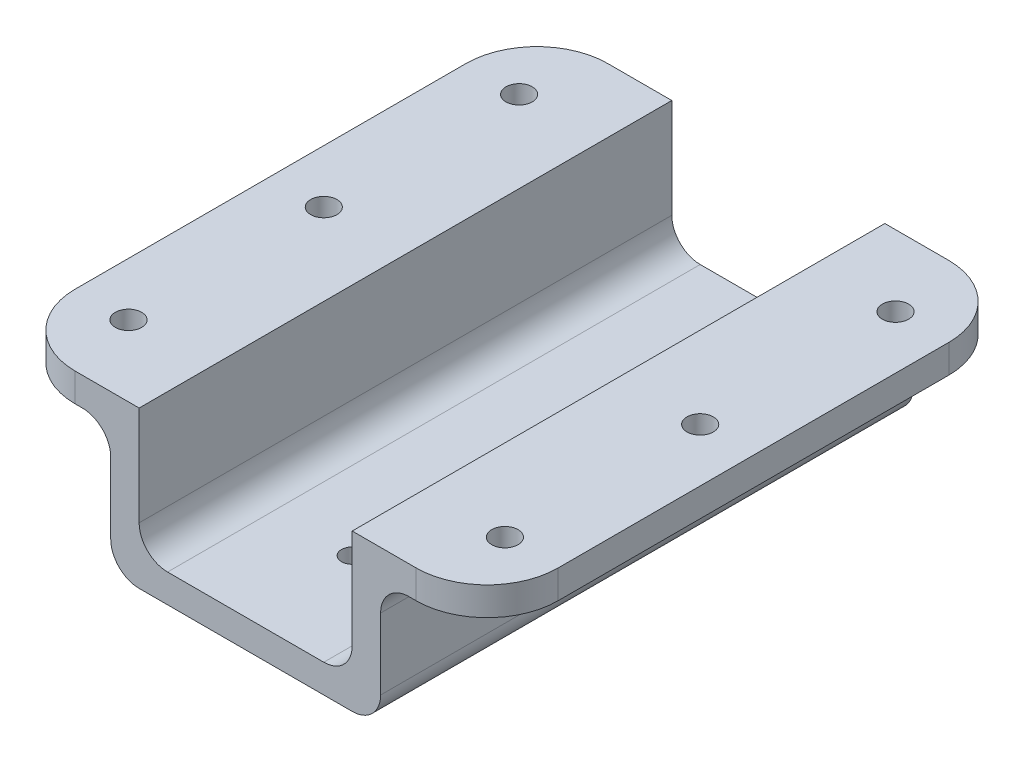
ISO-10303-21;
HEADER;
FILE_DESCRIPTION(('STEP AP214'),'2;1');
FILE_NAME('part.step','',(''),(''),'','','');
FILE_SCHEMA(('AUTOMOTIVE_DESIGN { 1 0 10303 214 1 1 1 1 }'));
ENDSEC;
DATA;
#1=APPLICATION_CONTEXT('core data for automotive mechanical design processes');
#2=APPLICATION_PROTOCOL_DEFINITION('international standard','automotive_design',2000,#1);
#3=PRODUCT_CONTEXT('',#1,'mechanical');
#4=PRODUCT('Part','Part','',(#3));
#5=PRODUCT_RELATED_PRODUCT_CATEGORY('part','',(#4));
#6=PRODUCT_DEFINITION_FORMATION('','',#4);
#7=PRODUCT_DEFINITION_CONTEXT('part definition',#1,'design');
#8=PRODUCT_DEFINITION('design','',#6,#7);
#9=PRODUCT_DEFINITION_SHAPE('','',#8);
#10=(LENGTH_UNIT() NAMED_UNIT(*) SI_UNIT(.MILLI.,.METRE.));
#11=(NAMED_UNIT(*) PLANE_ANGLE_UNIT() SI_UNIT($,.RADIAN.));
#12=(NAMED_UNIT(*) SI_UNIT($,.STERADIAN.) SOLID_ANGLE_UNIT());
#13=UNCERTAINTY_MEASURE_WITH_UNIT(LENGTH_MEASURE(1.E-05),#10,'distance_accuracy_value','');
#14=(GEOMETRIC_REPRESENTATION_CONTEXT(3) GLOBAL_UNCERTAINTY_ASSIGNED_CONTEXT((#13)) GLOBAL_UNIT_ASSIGNED_CONTEXT((#10,
#11,#12)) REPRESENTATION_CONTEXT('',''));
#15=CARTESIAN_POINT('',(0.,0.,0.));
#16=DIRECTION('',(0.,0.,1.));
#17=DIRECTION('',(1.,0.,0.));
#18=AXIS2_PLACEMENT_3D('',#15,#16,#17);
#19=CARTESIAN_POINT('',(-34.,14.,37.5));
#20=DIRECTION('',(1.,0.,0.));
#21=DIRECTION('',(0.,0.,-1.));
#22=AXIS2_PLACEMENT_3D('',#19,#20,#21);
#23=PLANE('',#22);
#24=DIRECTION('',(0.,0.,-1.));
#25=VECTOR('',#24,1.);
#26=CARTESIAN_POINT('',(-34.,18.,37.5));
#27=LINE('',#26,#25);
#28=CARTESIAN_POINT('',(-34.,18.,27.5));
#29=VERTEX_POINT('',#28);
#30=CARTESIAN_POINT('',(-34.,18.,-27.5));
#31=VERTEX_POINT('',#30);
#32=EDGE_CURVE('E223',#29,#31,#27,.T.);
#33=ORIENTED_EDGE('',*,*,#32,.T.);
#34=DIRECTION('',(0.,-1.,0.));
#35=VECTOR('',#34,1.);
#36=CARTESIAN_POINT('',(-34.,14.,-27.5));
#37=LINE('',#36,#35);
#38=CARTESIAN_POINT('',(-34.,14.,-27.5));
#39=VERTEX_POINT('',#38);
#40=EDGE_CURVE('E303',#31,#39,#37,.T.);
#41=ORIENTED_EDGE('',*,*,#40,.T.);
#42=DIRECTION('',(0.,0.,-1.));
#43=VECTOR('',#42,1.);
#44=CARTESIAN_POINT('',(-34.,14.,37.5));
#45=LINE('',#44,#43);
#46=CARTESIAN_POINT('',(-34.,14.,27.5));
#47=VERTEX_POINT('',#46);
#48=EDGE_CURVE('E259',#47,#39,#45,.T.);
#49=ORIENTED_EDGE('',*,*,#48,.F.);
#50=DIRECTION('',(0.,-1.,0.));
#51=VECTOR('',#50,1.);
#52=CARTESIAN_POINT('',(-34.,14.,27.5));
#53=LINE('',#52,#51);
#54=EDGE_CURVE('E57',#47,#29,#53,.F.);
#55=ORIENTED_EDGE('',*,*,#54,.T.);
#56=EDGE_LOOP('',(#33,#41,#49,#55));
#57=FACE_BOUND('',#56,.T.);
#58=ADVANCED_FACE('F35',(#57),#23,.F.);
#59=CARTESIAN_POINT('',(-19.,14.,37.5));
#60=DIRECTION('',(0.,1.,0.));
#61=DIRECTION('',(-1.,0.,0.));
#62=AXIS2_PLACEMENT_3D('',#59,#60,#61);
#63=PLANE('',#62);
#64=CARTESIAN_POINT('',(-26.5,14.,27.5));
#65=DIRECTION('',(0.,1.,0.));
#66=DIRECTION('',(-1.,0.,0.));
#67=AXIS2_PLACEMENT_3D('',#64,#65,#66);
#68=CIRCLE('',#67,1.85);
#69=CARTESIAN_POINT('',(-28.35,14.,27.5));
#70=VERTEX_POINT('',#69);
#71=EDGE_CURVE('E267',#70,#70,#68,.T.);
#72=ORIENTED_EDGE('',*,*,#71,.T.);
#73=EDGE_LOOP('',(#72));
#74=FACE_BOUND('',#73,.T.);
#75=CARTESIAN_POINT('',(-26.5,14.,0.));
#76=DIRECTION('',(0.,1.,0.));
#77=DIRECTION('',(-1.,0.,0.));
#78=AXIS2_PLACEMENT_3D('',#75,#76,#77);
#79=CIRCLE('',#78,1.85);
#80=CARTESIAN_POINT('',(-28.35,14.,0.));
#81=VERTEX_POINT('',#80);
#82=EDGE_CURVE('E546',#81,#81,#79,.T.);
#83=ORIENTED_EDGE('',*,*,#82,.T.);
#84=EDGE_LOOP('',(#83));
#85=FACE_BOUND('',#84,.T.);
#86=CARTESIAN_POINT('',(-26.5,14.,-27.5));
#87=DIRECTION('',(0.,1.,0.));
#88=DIRECTION('',(-1.,0.,0.));
#89=AXIS2_PLACEMENT_3D('',#86,#87,#88);
#90=CIRCLE('',#89,1.85);
#91=CARTESIAN_POINT('',(-28.35,14.,-27.5));
#92=VERTEX_POINT('',#91);
#93=EDGE_CURVE('E548',#92,#92,#90,.T.);
#94=ORIENTED_EDGE('',*,*,#93,.T.);
#95=EDGE_LOOP('',(#94));
#96=FACE_BOUND('',#95,.T.);
#97=ORIENTED_EDGE('',*,*,#48,.T.);
#98=CARTESIAN_POINT('',(-24.,14.,-27.5));
#99=DIRECTION('',(0.,1.,0.));
#100=DIRECTION('',(-1.,0.,0.));
#101=AXIS2_PLACEMENT_3D('',#98,#99,#100);
#102=CIRCLE('',#101,10.);
#103=CARTESIAN_POINT('',(-24.,14.,-37.5));
#104=VERTEX_POINT('',#103);
#105=EDGE_CURVE('E310',#39,#104,#102,.F.);
#106=ORIENTED_EDGE('',*,*,#105,.T.);
#107=DIRECTION('',(1.,0.,0.));
#108=VECTOR('',#107,1.);
#109=CARTESIAN_POINT('',(-19.,14.,-37.5));
#110=LINE('',#109,#108);
#111=CARTESIAN_POINT('',(-23.,14.,-37.5));
#112=VERTEX_POINT('',#111);
#113=EDGE_CURVE('E224',#104,#112,#110,.T.);
#114=ORIENTED_EDGE('',*,*,#113,.T.);
#115=DIRECTION('',(0.,0.,-1.));
#116=VECTOR('',#115,1.);
#117=CARTESIAN_POINT('',(-23.,14.,37.5));
#118=LINE('',#117,#116);
#119=CARTESIAN_POINT('',(-23.,14.,37.5));
#120=VERTEX_POINT('',#119);
#121=EDGE_CURVE('E306',#112,#120,#118,.F.);
#122=ORIENTED_EDGE('',*,*,#121,.T.);
#123=DIRECTION('',(1.,0.,0.));
#124=VECTOR('',#123,1.);
#125=CARTESIAN_POINT('',(-19.,14.,37.5));
#126=LINE('',#125,#124);
#127=CARTESIAN_POINT('',(-24.,14.,37.5));
#128=VERTEX_POINT('',#127);
#129=EDGE_CURVE('E250',#128,#120,#126,.T.);
#130=ORIENTED_EDGE('',*,*,#129,.F.);
#131=CARTESIAN_POINT('',(-24.,14.,27.5));
#132=DIRECTION('',(0.,1.,0.));
#133=DIRECTION('',(-1.,0.,0.));
#134=AXIS2_PLACEMENT_3D('',#131,#132,#133);
#135=CIRCLE('',#134,10.);
#136=EDGE_CURVE('E308',#128,#47,#135,.F.);
#137=ORIENTED_EDGE('',*,*,#136,.T.);
#138=EDGE_LOOP('',(#97,#106,#114,#122,#130,#137));
#139=FACE_BOUND('',#138,.T.);
#140=ADVANCED_FACE('F376',(#74,#85,#96,#139),#63,.F.);
#141=CARTESIAN_POINT('',(-19.,-4.00000000000001,37.5));
#142=DIRECTION('',(1.,0.,0.));
#143=DIRECTION('',(0.,1.,0.));
#144=AXIS2_PLACEMENT_3D('',#141,#142,#143);
#145=PLANE('',#144);
#146=DIRECTION('',(0.,-1.,0.));
#147=VECTOR('',#146,1.);
#148=CARTESIAN_POINT('',(-19.,-4.00000000000001,37.5));
#149=LINE('',#148,#147);
#150=CARTESIAN_POINT('',(-19.,10.,37.5));
#151=VERTEX_POINT('',#150);
#152=CARTESIAN_POINT('',(-19.,0.,37.5));
#153=VERTEX_POINT('',#152);
#154=EDGE_CURVE('E393',#151,#153,#149,.T.);
#155=ORIENTED_EDGE('',*,*,#154,.F.);
#156=DIRECTION('',(0.,0.,-1.));
#157=VECTOR('',#156,1.);
#158=CARTESIAN_POINT('',(-19.,10.,-37.5));
#159=LINE('',#158,#157);
#160=CARTESIAN_POINT('',(-19.,10.,-37.5));
#161=VERTEX_POINT('',#160);
#162=EDGE_CURVE('E317',#151,#161,#159,.T.);
#163=ORIENTED_EDGE('',*,*,#162,.T.);
#164=DIRECTION('',(0.,-1.,0.));
#165=VECTOR('',#164,1.);
#166=CARTESIAN_POINT('',(-19.,-4.00000000000001,-37.5));
#167=LINE('',#166,#165);
#168=CARTESIAN_POINT('',(-19.,0.,-37.5));
#169=VERTEX_POINT('',#168);
#170=EDGE_CURVE('E227',#161,#169,#167,.T.);
#171=ORIENTED_EDGE('',*,*,#170,.T.);
#172=DIRECTION('',(0.,0.,-1.));
#173=VECTOR('',#172,1.);
#174=CARTESIAN_POINT('',(-19.,0.,37.5));
#175=LINE('',#174,#173);
#176=EDGE_CURVE('E315',#169,#153,#175,.F.);
#177=ORIENTED_EDGE('',*,*,#176,.T.);
#178=EDGE_LOOP('',(#155,#163,#171,#177));
#179=FACE_BOUND('',#178,.T.);
#180=ADVANCED_FACE('F390',(#179),#145,.F.);
#181=CARTESIAN_POINT('',(19.,-4.,37.5));
#182=DIRECTION('',(0.,1.,0.));
#183=DIRECTION('',(-1.,0.,0.));
#184=AXIS2_PLACEMENT_3D('',#181,#182,#183);
#185=PLANE('',#184);
#186=CARTESIAN_POINT('',(0.,-4.,-22.5));
#187=DIRECTION('',(0.,-1.,0.));
#188=DIRECTION('',(1.,0.,0.));
#189=AXIS2_PLACEMENT_3D('',#186,#187,#188);
#190=CIRCLE('',#189,1.5);
#191=CARTESIAN_POINT('',(1.50000000000001,-4.,-22.5));
#192=VERTEX_POINT('',#191);
#193=EDGE_CURVE('E572',#192,#192,#190,.T.);
#194=ORIENTED_EDGE('',*,*,#193,.F.);
#195=EDGE_LOOP('',(#194));
#196=FACE_BOUND('',#195,.T.);
#197=CARTESIAN_POINT('',(0.,-4.,22.5));
#198=DIRECTION('',(0.,-1.,0.));
#199=DIRECTION('',(1.,0.,0.));
#200=AXIS2_PLACEMENT_3D('',#197,#198,#199);
#201=CIRCLE('',#200,1.5);
#202=CARTESIAN_POINT('',(1.5,-4.,22.5));
#203=VERTEX_POINT('',#202);
#204=EDGE_CURVE('E553',#203,#203,#201,.T.);
#205=ORIENTED_EDGE('',*,*,#204,.F.);
#206=EDGE_LOOP('',(#205));
#207=FACE_BOUND('',#206,.T.);
#208=DIRECTION('',(1.,0.,0.));
#209=VECTOR('',#208,1.);
#210=CARTESIAN_POINT('',(19.,-4.,-37.5));
#211=LINE('',#210,#209);
#212=CARTESIAN_POINT('',(-15.,-4.,-37.5));
#213=VERTEX_POINT('',#212);
#214=CARTESIAN_POINT('',(15.,-4.,-37.5));
#215=VERTEX_POINT('',#214);
#216=EDGE_CURVE('E231',#213,#215,#211,.T.);
#217=ORIENTED_EDGE('',*,*,#216,.T.);
#218=DIRECTION('',(0.,0.,-1.));
#219=VECTOR('',#218,1.);
#220=CARTESIAN_POINT('',(15.,-4.,37.5));
#221=LINE('',#220,#219);
#222=CARTESIAN_POINT('',(15.,-4.,37.5));
#223=VERTEX_POINT('',#222);
#224=EDGE_CURVE('E328',#215,#223,#221,.F.);
#225=ORIENTED_EDGE('',*,*,#224,.T.);
#226=DIRECTION('',(1.,0.,0.));
#227=VECTOR('',#226,1.);
#228=CARTESIAN_POINT('',(19.,-4.,37.5));
#229=LINE('',#228,#227);
#230=CARTESIAN_POINT('',(-15.,-4.,37.5));
#231=VERTEX_POINT('',#230);
#232=EDGE_CURVE('E395',#231,#223,#229,.T.);
#233=ORIENTED_EDGE('',*,*,#232,.F.);
#234=DIRECTION('',(0.,0.,-1.));
#235=VECTOR('',#234,1.);
#236=CARTESIAN_POINT('',(-15.,-4.,37.5));
#237=LINE('',#236,#235);
#238=EDGE_CURVE('E325',#231,#213,#237,.T.);
#239=ORIENTED_EDGE('',*,*,#238,.T.);
#240=EDGE_LOOP('',(#217,#225,#233,#239));
#241=FACE_BOUND('',#240,.T.);
#242=ADVANCED_FACE('F473',(#196,#207,#241),#185,.F.);
#243=CARTESIAN_POINT('',(19.,14.,37.5));
#244=DIRECTION('',(-1.,0.,0.));
#245=DIRECTION('',(0.,-1.,0.));
#246=AXIS2_PLACEMENT_3D('',#243,#244,#245);
#247=PLANE('',#246);
#248=DIRECTION('',(0.,1.,0.));
#249=VECTOR('',#248,1.);
#250=CARTESIAN_POINT('',(19.,14.,-37.5));
#251=LINE('',#250,#249);
#252=CARTESIAN_POINT('',(19.,0.,-37.5));
#253=VERTEX_POINT('',#252);
#254=CARTESIAN_POINT('',(19.,10.,-37.5));
#255=VERTEX_POINT('',#254);
#256=EDGE_CURVE('E234',#253,#255,#251,.T.);
#257=ORIENTED_EDGE('',*,*,#256,.T.);
#258=DIRECTION('',(0.,0.,-1.));
#259=VECTOR('',#258,1.);
#260=CARTESIAN_POINT('',(19.,10.,37.5));
#261=LINE('',#260,#259);
#262=CARTESIAN_POINT('',(19.,10.,37.5));
#263=VERTEX_POINT('',#262);
#264=EDGE_CURVE('E323',#255,#263,#261,.F.);
#265=ORIENTED_EDGE('',*,*,#264,.T.);
#266=DIRECTION('',(0.,1.,0.));
#267=VECTOR('',#266,1.);
#268=CARTESIAN_POINT('',(19.,14.,37.5));
#269=LINE('',#268,#267);
#270=CARTESIAN_POINT('',(19.,0.,37.5));
#271=VERTEX_POINT('',#270);
#272=EDGE_CURVE('E398',#271,#263,#269,.T.);
#273=ORIENTED_EDGE('',*,*,#272,.F.);
#274=DIRECTION('',(0.,0.,-1.));
#275=VECTOR('',#274,1.);
#276=CARTESIAN_POINT('',(19.,0.,37.5));
#277=LINE('',#276,#275);
#278=EDGE_CURVE('E320',#271,#253,#277,.T.);
#279=ORIENTED_EDGE('',*,*,#278,.T.);
#280=EDGE_LOOP('',(#257,#265,#273,#279));
#281=FACE_BOUND('',#280,.T.);
#282=ADVANCED_FACE('F467',(#281),#247,.F.);
#283=CARTESIAN_POINT('',(34.,14.,37.5));
#284=DIRECTION('',(0.,1.,0.));
#285=DIRECTION('',(-1.,0.,0.));
#286=AXIS2_PLACEMENT_3D('',#283,#284,#285);
#287=PLANE('',#286);
#288=CARTESIAN_POINT('',(26.5,14.,27.5));
#289=DIRECTION('',(0.,1.,0.));
#290=DIRECTION('',(-1.,0.,0.));
#291=AXIS2_PLACEMENT_3D('',#288,#289,#290);
#292=CIRCLE('',#291,1.85);
#293=CARTESIAN_POINT('',(24.65,14.,27.5));
#294=VERTEX_POINT('',#293);
#295=EDGE_CURVE('E228',#294,#294,#292,.T.);
#296=ORIENTED_EDGE('',*,*,#295,.T.);
#297=EDGE_LOOP('',(#296));
#298=FACE_BOUND('',#297,.T.);
#299=CARTESIAN_POINT('',(26.5,14.,-27.5));
#300=DIRECTION('',(0.,1.,0.));
#301=DIRECTION('',(-1.,0.,0.));
#302=AXIS2_PLACEMENT_3D('',#299,#300,#301);
#303=CIRCLE('',#302,1.85);
#304=CARTESIAN_POINT('',(24.65,14.,-27.5));
#305=VERTEX_POINT('',#304);
#306=EDGE_CURVE('E559',#305,#305,#303,.T.);
#307=ORIENTED_EDGE('',*,*,#306,.T.);
#308=EDGE_LOOP('',(#307));
#309=FACE_BOUND('',#308,.T.);
#310=CARTESIAN_POINT('',(26.5,14.,0.));
#311=DIRECTION('',(0.,1.,0.));
#312=DIRECTION('',(-1.,0.,0.));
#313=AXIS2_PLACEMENT_3D('',#310,#311,#312);
#314=CIRCLE('',#313,1.85);
#315=CARTESIAN_POINT('',(24.65,14.,0.));
#316=VERTEX_POINT('',#315);
#317=EDGE_CURVE('E270',#316,#316,#314,.T.);
#318=ORIENTED_EDGE('',*,*,#317,.T.);
#319=EDGE_LOOP('',(#318));
#320=FACE_BOUND('',#319,.T.);
#321=DIRECTION('',(0.,0.,-1.));
#322=VECTOR('',#321,1.);
#323=CARTESIAN_POINT('',(34.,14.,37.5));
#324=LINE('',#323,#322);
#325=CARTESIAN_POINT('',(34.,14.,27.5));
#326=VERTEX_POINT('',#325);
#327=CARTESIAN_POINT('',(34.,14.,-27.5));
#328=VERTEX_POINT('',#327);
#329=EDGE_CURVE('E256',#326,#328,#324,.T.);
#330=ORIENTED_EDGE('',*,*,#329,.F.);
#331=CARTESIAN_POINT('',(24.,14.,27.5));
#332=DIRECTION('',(0.,1.,0.));
#333=DIRECTION('',(-1.,0.,0.));
#334=AXIS2_PLACEMENT_3D('',#331,#332,#333);
#335=CIRCLE('',#334,10.);
#336=CARTESIAN_POINT('',(24.,14.,37.5));
#337=VERTEX_POINT('',#336);
#338=EDGE_CURVE('E292',#326,#337,#335,.F.);
#339=ORIENTED_EDGE('',*,*,#338,.T.);
#340=DIRECTION('',(1.,0.,0.));
#341=VECTOR('',#340,1.);
#342=CARTESIAN_POINT('',(34.,14.,37.5));
#343=LINE('',#342,#341);
#344=CARTESIAN_POINT('',(23.,14.,37.5));
#345=VERTEX_POINT('',#344);
#346=EDGE_CURVE('E196',#345,#337,#343,.T.);
#347=ORIENTED_EDGE('',*,*,#346,.F.);
#348=DIRECTION('',(0.,0.,-1.));
#349=VECTOR('',#348,1.);
#350=CARTESIAN_POINT('',(23.,14.,-37.5));
#351=LINE('',#350,#349);
#352=CARTESIAN_POINT('',(23.,14.,-37.5));
#353=VERTEX_POINT('',#352);
#354=EDGE_CURVE('E287',#345,#353,#351,.T.);
#355=ORIENTED_EDGE('',*,*,#354,.T.);
#356=DIRECTION('',(1.,0.,0.));
#357=VECTOR('',#356,1.);
#358=CARTESIAN_POINT('',(34.,14.,-37.5));
#359=LINE('',#358,#357);
#360=CARTESIAN_POINT('',(24.,14.,-37.5));
#361=VERTEX_POINT('',#360);
#362=EDGE_CURVE('E237',#353,#361,#359,.T.);
#363=ORIENTED_EDGE('',*,*,#362,.T.);
#364=CARTESIAN_POINT('',(24.,14.,-27.5));
#365=DIRECTION('',(0.,1.,0.));
#366=DIRECTION('',(-1.,0.,0.));
#367=AXIS2_PLACEMENT_3D('',#364,#365,#366);
#368=CIRCLE('',#367,10.);
#369=EDGE_CURVE('E290',#361,#328,#368,.F.);
#370=ORIENTED_EDGE('',*,*,#369,.T.);
#371=EDGE_LOOP('',(#330,#339,#347,#355,#363,#370));
#372=FACE_BOUND('',#371,.T.);
#373=ADVANCED_FACE('F470',(#298,#309,#320,#372),#287,.F.);
#374=CARTESIAN_POINT('',(34.,18.,37.5));
#375=DIRECTION('',(-1.,0.,0.));
#376=DIRECTION('',(0.,0.,1.));
#377=AXIS2_PLACEMENT_3D('',#374,#375,#376);
#378=PLANE('',#377);
#379=DIRECTION('',(0.,0.,-1.));
#380=VECTOR('',#379,1.);
#381=CARTESIAN_POINT('',(34.,18.,37.5));
#382=LINE('',#381,#380);
#383=CARTESIAN_POINT('',(34.,18.,27.5));
#384=VERTEX_POINT('',#383);
#385=CARTESIAN_POINT('',(34.,18.,-27.5));
#386=VERTEX_POINT('',#385);
#387=EDGE_CURVE('E206',#384,#386,#382,.T.);
#388=ORIENTED_EDGE('',*,*,#387,.F.);
#389=DIRECTION('',(0.,1.,0.));
#390=VECTOR('',#389,1.);
#391=CARTESIAN_POINT('',(34.,18.,27.5));
#392=LINE('',#391,#390);
#393=EDGE_CURVE('E285',#384,#326,#392,.F.);
#394=ORIENTED_EDGE('',*,*,#393,.T.);
#395=ORIENTED_EDGE('',*,*,#329,.T.);
#396=DIRECTION('',(0.,1.,0.));
#397=VECTOR('',#396,1.);
#398=CARTESIAN_POINT('',(34.,18.,-27.5));
#399=LINE('',#398,#397);
#400=EDGE_CURVE('E282',#328,#386,#399,.T.);
#401=ORIENTED_EDGE('',*,*,#400,.T.);
#402=EDGE_LOOP('',(#388,#394,#395,#401));
#403=FACE_BOUND('',#402,.T.);
#404=ADVANCED_FACE('F414',(#403),#378,.F.);
#405=CARTESIAN_POINT('',(15.,18.,37.5));
#406=DIRECTION('',(0.,-1.,0.));
#407=DIRECTION('',(1.,0.,0.));
#408=AXIS2_PLACEMENT_3D('',#405,#406,#407);
#409=PLANE('',#408);
#410=CARTESIAN_POINT('',(26.5,18.,27.5));
#411=DIRECTION('',(0.,-1.,0.));
#412=DIRECTION('',(1.,0.,0.));
#413=AXIS2_PLACEMENT_3D('',#410,#411,#412);
#414=CIRCLE('',#413,1.85);
#415=CARTESIAN_POINT('',(28.35,18.,27.5));
#416=VERTEX_POINT('',#415);
#417=EDGE_CURVE('E576',#416,#416,#414,.T.);
#418=ORIENTED_EDGE('',*,*,#417,.T.);
#419=EDGE_LOOP('',(#418));
#420=FACE_BOUND('',#419,.T.);
#421=CARTESIAN_POINT('',(26.5,18.,-27.5));
#422=DIRECTION('',(0.,-1.,0.));
#423=DIRECTION('',(1.,0.,0.));
#424=AXIS2_PLACEMENT_3D('',#421,#422,#423);
#425=CIRCLE('',#424,1.85);
#426=CARTESIAN_POINT('',(28.35,18.,-27.5));
#427=VERTEX_POINT('',#426);
#428=EDGE_CURVE('E573',#427,#427,#425,.T.);
#429=ORIENTED_EDGE('',*,*,#428,.T.);
#430=EDGE_LOOP('',(#429));
#431=FACE_BOUND('',#430,.T.);
#432=CARTESIAN_POINT('',(26.5,18.,0.));
#433=DIRECTION('',(0.,-1.,0.));
#434=DIRECTION('',(1.,0.,0.));
#435=AXIS2_PLACEMENT_3D('',#432,#433,#434);
#436=CIRCLE('',#435,1.85);
#437=CARTESIAN_POINT('',(28.35,18.,0.));
#438=VERTEX_POINT('',#437);
#439=EDGE_CURVE('E577',#438,#438,#436,.T.);
#440=ORIENTED_EDGE('',*,*,#439,.T.);
#441=EDGE_LOOP('',(#440));
#442=FACE_BOUND('',#441,.T.);
#443=DIRECTION('',(-1.,0.,0.));
#444=VECTOR('',#443,1.);
#445=CARTESIAN_POINT('',(15.,18.,37.5));
#446=LINE('',#445,#444);
#447=CARTESIAN_POINT('',(24.,18.,37.5));
#448=VERTEX_POINT('',#447);
#449=CARTESIAN_POINT('',(15.,18.,37.5));
#450=VERTEX_POINT('',#449);
#451=EDGE_CURVE('E186',#448,#450,#446,.T.);
#452=ORIENTED_EDGE('',*,*,#451,.F.);
#453=CARTESIAN_POINT('',(24.,18.,27.5));
#454=DIRECTION('',(0.,-1.,0.));
#455=DIRECTION('',(1.,0.,0.));
#456=AXIS2_PLACEMENT_3D('',#453,#454,#455);
#457=CIRCLE('',#456,10.);
#458=EDGE_CURVE('E280',#448,#384,#457,.F.);
#459=ORIENTED_EDGE('',*,*,#458,.T.);
#460=ORIENTED_EDGE('',*,*,#387,.T.);
#461=CARTESIAN_POINT('',(24.,18.,-27.5));
#462=DIRECTION('',(0.,-1.,0.));
#463=DIRECTION('',(1.,0.,0.));
#464=AXIS2_PLACEMENT_3D('',#461,#462,#463);
#465=CIRCLE('',#464,10.);
#466=CARTESIAN_POINT('',(24.,18.,-37.5));
#467=VERTEX_POINT('',#466);
#468=EDGE_CURVE('E278',#386,#467,#465,.F.);
#469=ORIENTED_EDGE('',*,*,#468,.T.);
#470=DIRECTION('',(-1.,0.,0.));
#471=VECTOR('',#470,1.);
#472=CARTESIAN_POINT('',(15.,18.,-37.5));
#473=LINE('',#472,#471);
#474=CARTESIAN_POINT('',(15.,18.,-37.5));
#475=VERTEX_POINT('',#474);
#476=EDGE_CURVE('E202',#467,#475,#473,.T.);
#477=ORIENTED_EDGE('',*,*,#476,.T.);
#478=DIRECTION('',(0.,0.,-1.));
#479=VECTOR('',#478,1.);
#480=CARTESIAN_POINT('',(15.,18.,37.5));
#481=LINE('',#480,#479);
#482=EDGE_CURVE('E199',#450,#475,#481,.T.);
#483=ORIENTED_EDGE('',*,*,#482,.F.);
#484=EDGE_LOOP('',(#452,#459,#460,#469,#477,#483));
#485=FACE_BOUND('',#484,.T.);
#486=ADVANCED_FACE('F200',(#420,#431,#442,#485),#409,.F.);
#487=CARTESIAN_POINT('',(15.,0.,37.5));
#488=DIRECTION('',(1.,0.,0.));
#489=DIRECTION('',(0.,1.,0.));
#490=AXIS2_PLACEMENT_3D('',#487,#488,#489);
#491=PLANE('',#490);
#492=DIRECTION('',(0.,-1.,0.));
#493=VECTOR('',#492,1.);
#494=CARTESIAN_POINT('',(15.,0.,-37.5));
#495=LINE('',#494,#493);
#496=CARTESIAN_POINT('',(15.,4.00000000000001,-37.5));
#497=VERTEX_POINT('',#496);
#498=EDGE_CURVE('E241',#475,#497,#495,.T.);
#499=ORIENTED_EDGE('',*,*,#498,.T.);
#500=DIRECTION('',(0.,0.,-1.));
#501=VECTOR('',#500,1.);
#502=CARTESIAN_POINT('',(15.,4.00000000000001,37.5));
#503=LINE('',#502,#501);
#504=CARTESIAN_POINT('',(15.,4.00000000000001,37.5));
#505=VERTEX_POINT('',#504);
#506=EDGE_CURVE('E211',#497,#505,#503,.F.);
#507=ORIENTED_EDGE('',*,*,#506,.T.);
#508=DIRECTION('',(0.,-1.,0.));
#509=VECTOR('',#508,1.);
#510=CARTESIAN_POINT('',(15.,0.,37.5));
#511=LINE('',#510,#509);
#512=EDGE_CURVE('E191',#450,#505,#511,.T.);
#513=ORIENTED_EDGE('',*,*,#512,.F.);
#514=ORIENTED_EDGE('',*,*,#482,.T.);
#515=EDGE_LOOP('',(#499,#507,#513,#514));
#516=FACE_BOUND('',#515,.T.);
#517=ADVANCED_FACE('F209',(#516),#491,.F.);
#518=CARTESIAN_POINT('',(-15.,0.,37.5));
#519=DIRECTION('',(0.,-1.,0.));
#520=DIRECTION('',(1.,0.,0.));
#521=AXIS2_PLACEMENT_3D('',#518,#519,#520);
#522=PLANE('',#521);
#523=CARTESIAN_POINT('',(0.,0.,-22.5));
#524=DIRECTION('',(0.,-1.,0.));
#525=DIRECTION('',(1.,0.,0.));
#526=AXIS2_PLACEMENT_3D('',#523,#524,#525);
#527=CIRCLE('',#526,1.5);
#528=CARTESIAN_POINT('',(1.50000000000001,0.,-22.5));
#529=VERTEX_POINT('',#528);
#530=EDGE_CURVE('E266',#529,#529,#527,.T.);
#531=ORIENTED_EDGE('',*,*,#530,.T.);
#532=EDGE_LOOP('',(#531));
#533=FACE_BOUND('',#532,.T.);
#534=CARTESIAN_POINT('',(0.,0.,22.5));
#535=DIRECTION('',(0.,-1.,0.));
#536=DIRECTION('',(1.,0.,0.));
#537=AXIS2_PLACEMENT_3D('',#534,#535,#536);
#538=CIRCLE('',#537,1.5);
#539=CARTESIAN_POINT('',(1.5,0.,22.5));
#540=VERTEX_POINT('',#539);
#541=EDGE_CURVE('E263',#540,#540,#538,.T.);
#542=ORIENTED_EDGE('',*,*,#541,.T.);
#543=EDGE_LOOP('',(#542));
#544=FACE_BOUND('',#543,.T.);
#545=DIRECTION('',(-1.,0.,0.));
#546=VECTOR('',#545,1.);
#547=CARTESIAN_POINT('',(-15.,0.,37.5));
#548=LINE('',#547,#546);
#549=CARTESIAN_POINT('',(11.,0.,37.5));
#550=VERTEX_POINT('',#549);
#551=CARTESIAN_POINT('',(-11.,0.,37.5));
#552=VERTEX_POINT('',#551);
#553=EDGE_CURVE('E212',#550,#552,#548,.T.);
#554=ORIENTED_EDGE('',*,*,#553,.F.);
#555=DIRECTION('',(0.,0.,-1.));
#556=VECTOR('',#555,1.);
#557=CARTESIAN_POINT('',(11.,0.,-37.5));
#558=LINE('',#557,#556);
#559=CARTESIAN_POINT('',(11.,0.,-37.5));
#560=VERTEX_POINT('',#559);
#561=EDGE_CURVE('E332',#550,#560,#558,.T.);
#562=ORIENTED_EDGE('',*,*,#561,.T.);
#563=DIRECTION('',(-1.,0.,0.));
#564=VECTOR('',#563,1.);
#565=CARTESIAN_POINT('',(-15.,0.,-37.5));
#566=LINE('',#565,#564);
#567=CARTESIAN_POINT('',(-11.,0.,-37.5));
#568=VERTEX_POINT('',#567);
#569=EDGE_CURVE('E243',#560,#568,#566,.T.);
#570=ORIENTED_EDGE('',*,*,#569,.T.);
#571=DIRECTION('',(0.,0.,-1.));
#572=VECTOR('',#571,1.);
#573=CARTESIAN_POINT('',(-11.,0.,37.5));
#574=LINE('',#573,#572);
#575=EDGE_CURVE('E330',#568,#552,#574,.F.);
#576=ORIENTED_EDGE('',*,*,#575,.T.);
#577=EDGE_LOOP('',(#554,#562,#570,#576));
#578=FACE_BOUND('',#577,.T.);
#579=ADVANCED_FACE('F360',(#533,#544,#578),#522,.F.);
#580=CARTESIAN_POINT('',(-15.,18.,37.5));
#581=DIRECTION('',(-1.,0.,0.));
#582=DIRECTION('',(0.,-1.,0.));
#583=AXIS2_PLACEMENT_3D('',#580,#581,#582);
#584=PLANE('',#583);
#585=DIRECTION('',(0.,1.,0.));
#586=VECTOR('',#585,1.);
#587=CARTESIAN_POINT('',(-15.,18.,37.5));
#588=LINE('',#587,#586);
#589=CARTESIAN_POINT('',(-15.,4.,37.5));
#590=VERTEX_POINT('',#589);
#591=CARTESIAN_POINT('',(-15.,18.,37.5));
#592=VERTEX_POINT('',#591);
#593=EDGE_CURVE('E215',#590,#592,#588,.T.);
#594=ORIENTED_EDGE('',*,*,#593,.F.);
#595=DIRECTION('',(0.,0.,-1.));
#596=VECTOR('',#595,1.);
#597=CARTESIAN_POINT('',(-15.,4.,-37.5));
#598=LINE('',#597,#596);
#599=CARTESIAN_POINT('',(-15.,4.,-37.5));
#600=VERTEX_POINT('',#599);
#601=EDGE_CURVE('E336',#590,#600,#598,.T.);
#602=ORIENTED_EDGE('',*,*,#601,.T.);
#603=DIRECTION('',(0.,1.,0.));
#604=VECTOR('',#603,1.);
#605=CARTESIAN_POINT('',(-15.,18.,-37.5));
#606=LINE('',#605,#604);
#607=CARTESIAN_POINT('',(-15.,18.,-37.5));
#608=VERTEX_POINT('',#607);
#609=EDGE_CURVE('E246',#600,#608,#606,.T.);
#610=ORIENTED_EDGE('',*,*,#609,.T.);
#611=DIRECTION('',(0.,0.,-1.));
#612=VECTOR('',#611,1.);
#613=CARTESIAN_POINT('',(-15.,18.,37.5));
#614=LINE('',#613,#612);
#615=EDGE_CURVE('E207',#592,#608,#614,.T.);
#616=ORIENTED_EDGE('',*,*,#615,.F.);
#617=EDGE_LOOP('',(#594,#602,#610,#616));
#618=FACE_BOUND('',#617,.T.);
#619=ADVANCED_FACE('F366',(#618),#584,.F.);
#620=CARTESIAN_POINT('',(-34.,18.,37.5));
#621=DIRECTION('',(0.,-1.,0.));
#622=DIRECTION('',(0.,0.,-1.));
#623=AXIS2_PLACEMENT_3D('',#620,#621,#622);
#624=PLANE('',#623);
#625=CARTESIAN_POINT('',(-26.5,18.,27.5));
#626=DIRECTION('',(0.,-1.,0.));
#627=DIRECTION('',(1.,0.,0.));
#628=AXIS2_PLACEMENT_3D('',#625,#626,#627);
#629=CIRCLE('',#628,1.85);
#630=CARTESIAN_POINT('',(-24.65,18.,27.5));
#631=VERTEX_POINT('',#630);
#632=EDGE_CURVE('E583',#631,#631,#629,.T.);
#633=ORIENTED_EDGE('',*,*,#632,.T.);
#634=EDGE_LOOP('',(#633));
#635=FACE_BOUND('',#634,.T.);
#636=CARTESIAN_POINT('',(-26.5,18.,0.));
#637=DIRECTION('',(0.,-1.,0.));
#638=DIRECTION('',(1.,0.,0.));
#639=AXIS2_PLACEMENT_3D('',#636,#637,#638);
#640=CIRCLE('',#639,1.85);
#641=CARTESIAN_POINT('',(-24.65,18.,0.));
#642=VERTEX_POINT('',#641);
#643=EDGE_CURVE('E543',#642,#642,#640,.T.);
#644=ORIENTED_EDGE('',*,*,#643,.T.);
#645=EDGE_LOOP('',(#644));
#646=FACE_BOUND('',#645,.T.);
#647=CARTESIAN_POINT('',(-26.5,18.,-27.5));
#648=DIRECTION('',(0.,-1.,0.));
#649=DIRECTION('',(1.,0.,0.));
#650=AXIS2_PLACEMENT_3D('',#647,#648,#649);
#651=CIRCLE('',#650,1.85);
#652=CARTESIAN_POINT('',(-24.65,18.,-27.5));
#653=VERTEX_POINT('',#652);
#654=EDGE_CURVE('E580',#653,#653,#651,.T.);
#655=ORIENTED_EDGE('',*,*,#654,.T.);
#656=EDGE_LOOP('',(#655));
#657=FACE_BOUND('',#656,.T.);
#658=DIRECTION('',(-1.,0.,0.));
#659=VECTOR('',#658,1.);
#660=CARTESIAN_POINT('',(-34.,18.,-37.5));
#661=LINE('',#660,#659);
#662=CARTESIAN_POINT('',(-24.,18.,-37.5));
#663=VERTEX_POINT('',#662);
#664=EDGE_CURVE('E248',#608,#663,#661,.T.);
#665=ORIENTED_EDGE('',*,*,#664,.T.);
#666=CARTESIAN_POINT('',(-24.,18.,-27.5));
#667=DIRECTION('',(0.,-1.,0.));
#668=DIRECTION('',(0.,0.,-1.));
#669=AXIS2_PLACEMENT_3D('',#666,#667,#668);
#670=CIRCLE('',#669,10.);
#671=EDGE_CURVE('E50',#663,#31,#670,.F.);
#672=ORIENTED_EDGE('',*,*,#671,.T.);
#673=ORIENTED_EDGE('',*,*,#32,.F.);
#674=CARTESIAN_POINT('',(-24.,18.,27.5));
#675=DIRECTION('',(0.,-1.,0.));
#676=DIRECTION('',(0.,0.,-1.));
#677=AXIS2_PLACEMENT_3D('',#674,#675,#676);
#678=CIRCLE('',#677,10.);
#679=CARTESIAN_POINT('',(-24.,18.,37.5));
#680=VERTEX_POINT('',#679);
#681=EDGE_CURVE('E312',#29,#680,#678,.F.);
#682=ORIENTED_EDGE('',*,*,#681,.T.);
#683=DIRECTION('',(-1.,0.,0.));
#684=VECTOR('',#683,1.);
#685=CARTESIAN_POINT('',(-34.,18.,37.5));
#686=LINE('',#685,#684);
#687=EDGE_CURVE('E220',#592,#680,#686,.T.);
#688=ORIENTED_EDGE('',*,*,#687,.F.);
#689=ORIENTED_EDGE('',*,*,#615,.T.);
#690=EDGE_LOOP('',(#665,#672,#673,#682,#688,#689));
#691=FACE_BOUND('',#690,.T.);
#692=ADVANCED_FACE('F368',(#635,#646,#657,#691),#624,.F.);
#693=CARTESIAN_POINT('',(0.,0.,37.5));
#694=DIRECTION('',(0.,0.,-1.));
#695=DIRECTION('',(-1.,0.,0.));
#696=AXIS2_PLACEMENT_3D('',#693,#694,#695);
#697=PLANE('',#696);
#698=ORIENTED_EDGE('',*,*,#346,.T.);
#699=DIRECTION('',(0.,1.,0.));
#700=VECTOR('',#699,1.);
#701=CARTESIAN_POINT('',(24.,0.,37.5));
#702=LINE('',#701,#700);
#703=EDGE_CURVE('E194',#337,#448,#702,.T.);
#704=ORIENTED_EDGE('',*,*,#703,.T.);
#705=ORIENTED_EDGE('',*,*,#451,.T.);
#706=ORIENTED_EDGE('',*,*,#512,.T.);
#707=CARTESIAN_POINT('',(11.,4.00000000000001,37.5));
#708=DIRECTION('',(0.,0.,-1.));
#709=DIRECTION('',(-1.,0.,0.));
#710=AXIS2_PLACEMENT_3D('',#707,#708,#709);
#711=CIRCLE('',#710,4.);
#712=EDGE_CURVE('E349',#505,#550,#711,.T.);
#713=ORIENTED_EDGE('',*,*,#712,.T.);
#714=ORIENTED_EDGE('',*,*,#553,.T.);
#715=CARTESIAN_POINT('',(-11.,4.,37.5));
#716=DIRECTION('',(0.,0.,-1.));
#717=DIRECTION('',(-1.,0.,0.));
#718=AXIS2_PLACEMENT_3D('',#715,#716,#717);
#719=CIRCLE('',#718,4.);
#720=EDGE_CURVE('E12',#552,#590,#719,.T.);
#721=ORIENTED_EDGE('',*,*,#720,.T.);
#722=ORIENTED_EDGE('',*,*,#593,.T.);
#723=ORIENTED_EDGE('',*,*,#687,.T.);
#724=DIRECTION('',(0.,-1.,0.));
#725=VECTOR('',#724,1.);
#726=CARTESIAN_POINT('',(-24.,0.,37.5));
#727=LINE('',#726,#725);
#728=EDGE_CURVE('E274',#680,#128,#727,.T.);
#729=ORIENTED_EDGE('',*,*,#728,.T.);
#730=ORIENTED_EDGE('',*,*,#129,.T.);
#731=CARTESIAN_POINT('',(-23.,10.,37.5));
#732=DIRECTION('',(0.,0.,-1.));
#733=DIRECTION('',(-1.,0.,0.));
#734=AXIS2_PLACEMENT_3D('',#731,#732,#733);
#735=CIRCLE('',#734,4.);
#736=EDGE_CURVE('E341',#120,#151,#735,.T.);
#737=ORIENTED_EDGE('',*,*,#736,.T.);
#738=ORIENTED_EDGE('',*,*,#154,.T.);
#739=CARTESIAN_POINT('',(-15.,0.,37.5));
#740=DIRECTION('',(0.,0.,-1.));
#741=DIRECTION('',(-1.,0.,0.));
#742=AXIS2_PLACEMENT_3D('',#739,#740,#741);
#743=CIRCLE('',#742,4.);
#744=EDGE_CURVE('E262',#153,#231,#743,.F.);
#745=ORIENTED_EDGE('',*,*,#744,.T.);
#746=ORIENTED_EDGE('',*,*,#232,.T.);
#747=CARTESIAN_POINT('',(15.,0.,37.5));
#748=DIRECTION('',(0.,0.,-1.));
#749=DIRECTION('',(-1.,0.,0.));
#750=AXIS2_PLACEMENT_3D('',#747,#748,#749);
#751=CIRCLE('',#750,4.);
#752=EDGE_CURVE('E272',#223,#271,#751,.F.);
#753=ORIENTED_EDGE('',*,*,#752,.T.);
#754=ORIENTED_EDGE('',*,*,#272,.T.);
#755=CARTESIAN_POINT('',(23.,10.,37.5));
#756=DIRECTION('',(0.,0.,-1.));
#757=DIRECTION('',(-1.,0.,0.));
#758=AXIS2_PLACEMENT_3D('',#755,#756,#757);
#759=CIRCLE('',#758,4.);
#760=EDGE_CURVE('E345',#263,#345,#759,.T.);
#761=ORIENTED_EDGE('',*,*,#760,.T.);
#762=EDGE_LOOP('',(#698,#704,#705,#706,#713,#714,#721,#722,#723,#729,#730,#737,#738,#745,#746,
#753,#754,#761));
#763=FACE_BOUND('',#762,.T.);
#764=ADVANCED_FACE('F189',(#763),#697,.F.);
#765=CARTESIAN_POINT('',(0.,0.,-37.5));
#766=DIRECTION('',(0.,0.,-1.));
#767=DIRECTION('',(-1.,0.,0.));
#768=AXIS2_PLACEMENT_3D('',#765,#766,#767);
#769=PLANE('',#768);
#770=ORIENTED_EDGE('',*,*,#476,.F.);
#771=DIRECTION('',(0.,1.,0.));
#772=VECTOR('',#771,1.);
#773=CARTESIAN_POINT('',(24.,14.,-37.5));
#774=LINE('',#773,#772);
#775=EDGE_CURVE('E300',#467,#361,#774,.F.);
#776=ORIENTED_EDGE('',*,*,#775,.T.);
#777=ORIENTED_EDGE('',*,*,#362,.F.);
#778=CARTESIAN_POINT('',(23.,10.,-37.5));
#779=DIRECTION('',(0.,0.,-1.));
#780=DIRECTION('',(-1.,0.,0.));
#781=AXIS2_PLACEMENT_3D('',#778,#779,#780);
#782=CIRCLE('',#781,4.);
#783=EDGE_CURVE('E343',#353,#255,#782,.F.);
#784=ORIENTED_EDGE('',*,*,#783,.T.);
#785=ORIENTED_EDGE('',*,*,#256,.F.);
#786=CARTESIAN_POINT('',(15.,0.,-37.5));
#787=DIRECTION('',(0.,0.,-1.));
#788=DIRECTION('',(-1.,0.,0.));
#789=AXIS2_PLACEMENT_3D('',#786,#787,#788);
#790=CIRCLE('',#789,4.);
#791=EDGE_CURVE('E296',#253,#215,#790,.T.);
#792=ORIENTED_EDGE('',*,*,#791,.T.);
#793=ORIENTED_EDGE('',*,*,#216,.F.);
#794=CARTESIAN_POINT('',(-15.,0.,-37.5));
#795=DIRECTION('',(0.,0.,-1.));
#796=DIRECTION('',(-1.,0.,0.));
#797=AXIS2_PLACEMENT_3D('',#794,#795,#796);
#798=CIRCLE('',#797,4.);
#799=EDGE_CURVE('E294',#213,#169,#798,.T.);
#800=ORIENTED_EDGE('',*,*,#799,.T.);
#801=ORIENTED_EDGE('',*,*,#170,.F.);
#802=CARTESIAN_POINT('',(-23.,10.,-37.5));
#803=DIRECTION('',(0.,0.,-1.));
#804=DIRECTION('',(-1.,0.,0.));
#805=AXIS2_PLACEMENT_3D('',#802,#803,#804);
#806=CIRCLE('',#805,4.);
#807=EDGE_CURVE('E339',#161,#112,#806,.F.);
#808=ORIENTED_EDGE('',*,*,#807,.T.);
#809=ORIENTED_EDGE('',*,*,#113,.F.);
#810=DIRECTION('',(0.,-1.,0.));
#811=VECTOR('',#810,1.);
#812=CARTESIAN_POINT('',(-24.,18.,-37.5));
#813=LINE('',#812,#811);
#814=EDGE_CURVE('E298',#104,#663,#813,.F.);
#815=ORIENTED_EDGE('',*,*,#814,.T.);
#816=ORIENTED_EDGE('',*,*,#664,.F.);
#817=ORIENTED_EDGE('',*,*,#609,.F.);
#818=CARTESIAN_POINT('',(-11.,4.,-37.5));
#819=DIRECTION('',(0.,0.,-1.));
#820=DIRECTION('',(-1.,0.,0.));
#821=AXIS2_PLACEMENT_3D('',#818,#819,#820);
#822=CIRCLE('',#821,4.);
#823=EDGE_CURVE('E43',#600,#568,#822,.F.);
#824=ORIENTED_EDGE('',*,*,#823,.T.);
#825=ORIENTED_EDGE('',*,*,#569,.F.);
#826=CARTESIAN_POINT('',(11.,4.00000000000001,-37.5));
#827=DIRECTION('',(0.,0.,-1.));
#828=DIRECTION('',(-1.,0.,0.));
#829=AXIS2_PLACEMENT_3D('',#826,#827,#828);
#830=CIRCLE('',#829,4.);
#831=EDGE_CURVE('E347',#560,#497,#830,.F.);
#832=ORIENTED_EDGE('',*,*,#831,.T.);
#833=ORIENTED_EDGE('',*,*,#498,.F.);
#834=EDGE_LOOP('',(#770,#776,#777,#784,#785,#792,#793,#800,#801,#808,#809,#815,#816,#817,#824,
#825,#832,#833));
#835=FACE_BOUND('',#834,.T.);
#836=ADVANCED_FACE('F353',(#835),#769,.T.);
#837=CARTESIAN_POINT('',(-26.5,18.,-27.5));
#838=DIRECTION('',(0.,-1.,0.));
#839=DIRECTION('',(1.,0.,0.));
#840=AXIS2_PLACEMENT_3D('',#837,#838,#839);
#841=CYLINDRICAL_SURFACE('',#840,1.85);
#842=ORIENTED_EDGE('',*,*,#654,.F.);
#843=EDGE_LOOP('',(#842));
#844=FACE_BOUND('',#843,.T.);
#845=ORIENTED_EDGE('',*,*,#93,.F.);
#846=EDGE_LOOP('',(#845));
#847=FACE_BOUND('',#846,.T.);
#848=ADVANCED_FACE('F506',(#844,#847),#841,.F.);
#849=CARTESIAN_POINT('',(-26.5,18.,0.));
#850=DIRECTION('',(0.,-1.,0.));
#851=DIRECTION('',(1.,0.,0.));
#852=AXIS2_PLACEMENT_3D('',#849,#850,#851);
#853=CYLINDRICAL_SURFACE('',#852,1.85);
#854=ORIENTED_EDGE('',*,*,#643,.F.);
#855=EDGE_LOOP('',(#854));
#856=FACE_BOUND('',#855,.T.);
#857=ORIENTED_EDGE('',*,*,#82,.F.);
#858=EDGE_LOOP('',(#857));
#859=FACE_BOUND('',#858,.T.);
#860=ADVANCED_FACE('F528',(#856,#859),#853,.F.);
#861=CARTESIAN_POINT('',(-26.5,18.,27.5));
#862=DIRECTION('',(0.,-1.,0.));
#863=DIRECTION('',(1.,0.,0.));
#864=AXIS2_PLACEMENT_3D('',#861,#862,#863);
#865=CYLINDRICAL_SURFACE('',#864,1.85);
#866=ORIENTED_EDGE('',*,*,#632,.F.);
#867=EDGE_LOOP('',(#866));
#868=FACE_BOUND('',#867,.T.);
#869=ORIENTED_EDGE('',*,*,#71,.F.);
#870=EDGE_LOOP('',(#869));
#871=FACE_BOUND('',#870,.T.);
#872=ADVANCED_FACE('F513',(#868,#871),#865,.F.);
#873=CARTESIAN_POINT('',(0.,18.,22.5));
#874=DIRECTION('',(0.,-1.,0.));
#875=DIRECTION('',(1.,0.,0.));
#876=AXIS2_PLACEMENT_3D('',#873,#874,#875);
#877=CYLINDRICAL_SURFACE('',#876,1.5);
#878=ORIENTED_EDGE('',*,*,#204,.T.);
#879=EDGE_LOOP('',(#878));
#880=FACE_BOUND('',#879,.T.);
#881=ORIENTED_EDGE('',*,*,#541,.F.);
#882=EDGE_LOOP('',(#881));
#883=FACE_BOUND('',#882,.T.);
#884=ADVANCED_FACE('F509',(#880,#883),#877,.F.);
#885=CARTESIAN_POINT('',(0.,18.,-22.5));
#886=DIRECTION('',(0.,-1.,0.));
#887=DIRECTION('',(1.,0.,0.));
#888=AXIS2_PLACEMENT_3D('',#885,#886,#887);
#889=CYLINDRICAL_SURFACE('',#888,1.5);
#890=ORIENTED_EDGE('',*,*,#193,.T.);
#891=EDGE_LOOP('',(#890));
#892=FACE_BOUND('',#891,.T.);
#893=ORIENTED_EDGE('',*,*,#530,.F.);
#894=EDGE_LOOP('',(#893));
#895=FACE_BOUND('',#894,.T.);
#896=ADVANCED_FACE('F512',(#892,#895),#889,.F.);
#897=CARTESIAN_POINT('',(26.5,18.,0.));
#898=DIRECTION('',(0.,-1.,0.));
#899=DIRECTION('',(1.,0.,0.));
#900=AXIS2_PLACEMENT_3D('',#897,#898,#899);
#901=CYLINDRICAL_SURFACE('',#900,1.85);
#902=ORIENTED_EDGE('',*,*,#439,.F.);
#903=EDGE_LOOP('',(#902));
#904=FACE_BOUND('',#903,.T.);
#905=ORIENTED_EDGE('',*,*,#317,.F.);
#906=EDGE_LOOP('',(#905));
#907=FACE_BOUND('',#906,.T.);
#908=ADVANCED_FACE('F518',(#904,#907),#901,.F.);
#909=CARTESIAN_POINT('',(26.5,18.,-27.5));
#910=DIRECTION('',(0.,-1.,0.));
#911=DIRECTION('',(1.,0.,0.));
#912=AXIS2_PLACEMENT_3D('',#909,#910,#911);
#913=CYLINDRICAL_SURFACE('',#912,1.85);
#914=ORIENTED_EDGE('',*,*,#428,.F.);
#915=EDGE_LOOP('',(#914));
#916=FACE_BOUND('',#915,.T.);
#917=ORIENTED_EDGE('',*,*,#306,.F.);
#918=EDGE_LOOP('',(#917));
#919=FACE_BOUND('',#918,.T.);
#920=ADVANCED_FACE('F515',(#916,#919),#913,.F.);
#921=CARTESIAN_POINT('',(26.5,18.,27.5));
#922=DIRECTION('',(0.,-1.,0.));
#923=DIRECTION('',(1.,0.,0.));
#924=AXIS2_PLACEMENT_3D('',#921,#922,#923);
#925=CYLINDRICAL_SURFACE('',#924,1.85);
#926=ORIENTED_EDGE('',*,*,#417,.F.);
#927=EDGE_LOOP('',(#926));
#928=FACE_BOUND('',#927,.T.);
#929=ORIENTED_EDGE('',*,*,#295,.F.);
#930=EDGE_LOOP('',(#929));
#931=FACE_BOUND('',#930,.T.);
#932=ADVANCED_FACE('F444',(#928,#931),#925,.F.);
#933=CARTESIAN_POINT('',(24.,0.,27.5));
#934=DIRECTION('',(0.,1.,0.));
#935=DIRECTION('',(0.,0.,1.));
#936=AXIS2_PLACEMENT_3D('',#933,#934,#935);
#937=CYLINDRICAL_SURFACE('',#936,10.);
#938=ORIENTED_EDGE('',*,*,#338,.F.);
#939=ORIENTED_EDGE('',*,*,#393,.F.);
#940=ORIENTED_EDGE('',*,*,#458,.F.);
#941=ORIENTED_EDGE('',*,*,#703,.F.);
#942=EDGE_LOOP('',(#938,#939,#940,#941));
#943=FACE_BOUND('',#942,.T.);
#944=ADVANCED_FACE('F410',(#943),#937,.T.);
#945=CARTESIAN_POINT('',(24.,18.,-27.5));
#946=DIRECTION('',(0.,-1.,0.));
#947=DIRECTION('',(0.,0.,-1.));
#948=AXIS2_PLACEMENT_3D('',#945,#946,#947);
#949=CYLINDRICAL_SURFACE('',#948,10.);
#950=ORIENTED_EDGE('',*,*,#369,.F.);
#951=ORIENTED_EDGE('',*,*,#775,.F.);
#952=ORIENTED_EDGE('',*,*,#468,.F.);
#953=ORIENTED_EDGE('',*,*,#400,.F.);
#954=EDGE_LOOP('',(#950,#951,#952,#953));
#955=FACE_BOUND('',#954,.T.);
#956=ADVANCED_FACE('F419',(#955),#949,.T.);
#957=CARTESIAN_POINT('',(-24.,14.,-27.5));
#958=DIRECTION('',(0.,1.,0.));
#959=DIRECTION('',(0.,0.,1.));
#960=AXIS2_PLACEMENT_3D('',#957,#958,#959);
#961=CYLINDRICAL_SURFACE('',#960,10.);
#962=ORIENTED_EDGE('',*,*,#671,.F.);
#963=ORIENTED_EDGE('',*,*,#814,.F.);
#964=ORIENTED_EDGE('',*,*,#105,.F.);
#965=ORIENTED_EDGE('',*,*,#40,.F.);
#966=EDGE_LOOP('',(#962,#963,#964,#965));
#967=FACE_BOUND('',#966,.T.);
#968=ADVANCED_FACE('F379',(#967),#961,.T.);
#969=CARTESIAN_POINT('',(-24.,0.,27.5));
#970=DIRECTION('',(0.,-1.,0.));
#971=DIRECTION('',(0.,0.,-1.));
#972=AXIS2_PLACEMENT_3D('',#969,#970,#971);
#973=CYLINDRICAL_SURFACE('',#972,10.);
#974=ORIENTED_EDGE('',*,*,#681,.F.);
#975=ORIENTED_EDGE('',*,*,#54,.F.);
#976=ORIENTED_EDGE('',*,*,#136,.F.);
#977=ORIENTED_EDGE('',*,*,#728,.F.);
#978=EDGE_LOOP('',(#974,#975,#976,#977));
#979=FACE_BOUND('',#978,.T.);
#980=ADVANCED_FACE('F374',(#979),#973,.T.);
#981=CARTESIAN_POINT('',(-23.,10.,37.5));
#982=DIRECTION('',(0.,0.,1.));
#983=DIRECTION('',(1.,0.,0.));
#984=AXIS2_PLACEMENT_3D('',#981,#982,#983);
#985=CYLINDRICAL_SURFACE('',#984,4.);
#986=ORIENTED_EDGE('',*,*,#736,.F.);
#987=ORIENTED_EDGE('',*,*,#121,.F.);
#988=ORIENTED_EDGE('',*,*,#807,.F.);
#989=ORIENTED_EDGE('',*,*,#162,.F.);
#990=EDGE_LOOP('',(#986,#987,#988,#989));
#991=FACE_BOUND('',#990,.T.);
#992=ADVANCED_FACE('F387',(#991),#985,.F.);
#993=CARTESIAN_POINT('',(23.,10.,37.5));
#994=DIRECTION('',(0.,0.,1.));
#995=DIRECTION('',(1.,0.,0.));
#996=AXIS2_PLACEMENT_3D('',#993,#994,#995);
#997=CYLINDRICAL_SURFACE('',#996,4.);
#998=ORIENTED_EDGE('',*,*,#760,.F.);
#999=ORIENTED_EDGE('',*,*,#264,.F.);
#1000=ORIENTED_EDGE('',*,*,#783,.F.);
#1001=ORIENTED_EDGE('',*,*,#354,.F.);
#1002=EDGE_LOOP('',(#998,#999,#1000,#1001));
#1003=FACE_BOUND('',#1002,.T.);
#1004=ADVANCED_FACE('F453',(#1003),#997,.F.);
#1005=CARTESIAN_POINT('',(15.,0.,37.5));
#1006=DIRECTION('',(0.,0.,-1.));
#1007=DIRECTION('',(-1.,0.,0.));
#1008=AXIS2_PLACEMENT_3D('',#1005,#1006,#1007);
#1009=CYLINDRICAL_SURFACE('',#1008,4.);
#1010=ORIENTED_EDGE('',*,*,#752,.F.);
#1011=ORIENTED_EDGE('',*,*,#224,.F.);
#1012=ORIENTED_EDGE('',*,*,#791,.F.);
#1013=ORIENTED_EDGE('',*,*,#278,.F.);
#1014=EDGE_LOOP('',(#1010,#1011,#1012,#1013));
#1015=FACE_BOUND('',#1014,.T.);
#1016=ADVANCED_FACE('F430',(#1015),#1009,.T.);
#1017=CARTESIAN_POINT('',(-15.,0.,37.5));
#1018=DIRECTION('',(0.,0.,-1.));
#1019=DIRECTION('',(-1.,0.,0.));
#1020=AXIS2_PLACEMENT_3D('',#1017,#1018,#1019);
#1021=CYLINDRICAL_SURFACE('',#1020,4.);
#1022=ORIENTED_EDGE('',*,*,#744,.F.);
#1023=ORIENTED_EDGE('',*,*,#176,.F.);
#1024=ORIENTED_EDGE('',*,*,#799,.F.);
#1025=ORIENTED_EDGE('',*,*,#238,.F.);
#1026=EDGE_LOOP('',(#1022,#1023,#1024,#1025));
#1027=FACE_BOUND('',#1026,.T.);
#1028=ADVANCED_FACE('F425',(#1027),#1021,.T.);
#1029=CARTESIAN_POINT('',(11.,4.00000000000001,37.5));
#1030=DIRECTION('',(0.,0.,1.));
#1031=DIRECTION('',(1.,0.,0.));
#1032=AXIS2_PLACEMENT_3D('',#1029,#1030,#1031);
#1033=CYLINDRICAL_SURFACE('',#1032,4.);
#1034=ORIENTED_EDGE('',*,*,#712,.F.);
#1035=ORIENTED_EDGE('',*,*,#506,.F.);
#1036=ORIENTED_EDGE('',*,*,#831,.F.);
#1037=ORIENTED_EDGE('',*,*,#561,.F.);
#1038=EDGE_LOOP('',(#1034,#1035,#1036,#1037));
#1039=FACE_BOUND('',#1038,.T.);
#1040=ADVANCED_FACE('F423',(#1039),#1033,.F.);
#1041=CARTESIAN_POINT('',(-11.,4.,37.5));
#1042=DIRECTION('',(0.,0.,1.));
#1043=DIRECTION('',(1.,0.,0.));
#1044=AXIS2_PLACEMENT_3D('',#1041,#1042,#1043);
#1045=CYLINDRICAL_SURFACE('',#1044,4.);
#1046=ORIENTED_EDGE('',*,*,#720,.F.);
#1047=ORIENTED_EDGE('',*,*,#575,.F.);
#1048=ORIENTED_EDGE('',*,*,#823,.F.);
#1049=ORIENTED_EDGE('',*,*,#601,.F.);
#1050=EDGE_LOOP('',(#1046,#1047,#1048,#1049));
#1051=FACE_BOUND('',#1050,.T.);
#1052=ADVANCED_FACE('F37',(#1051),#1045,.F.);
#1053=CLOSED_SHELL('',(#58,#140,#180,#242,#282,#373,#404,#486,#517,#579,#619,#692,#764,#836,
#848,#860,#872,#884,#896,#908,#920,#932,#944,#956,#968,#980,#992,#1004,#1016,#1028,#1040,#1052));
#1054=MANIFOLD_SOLID_BREP('B2',#1053);
#1055=ADVANCED_BREP_SHAPE_REPRESENTATION('',(#18,#1054),#14);
#1056=SHAPE_DEFINITION_REPRESENTATION(#9,#1055);
ENDSEC;
END-ISO-10303-21;
